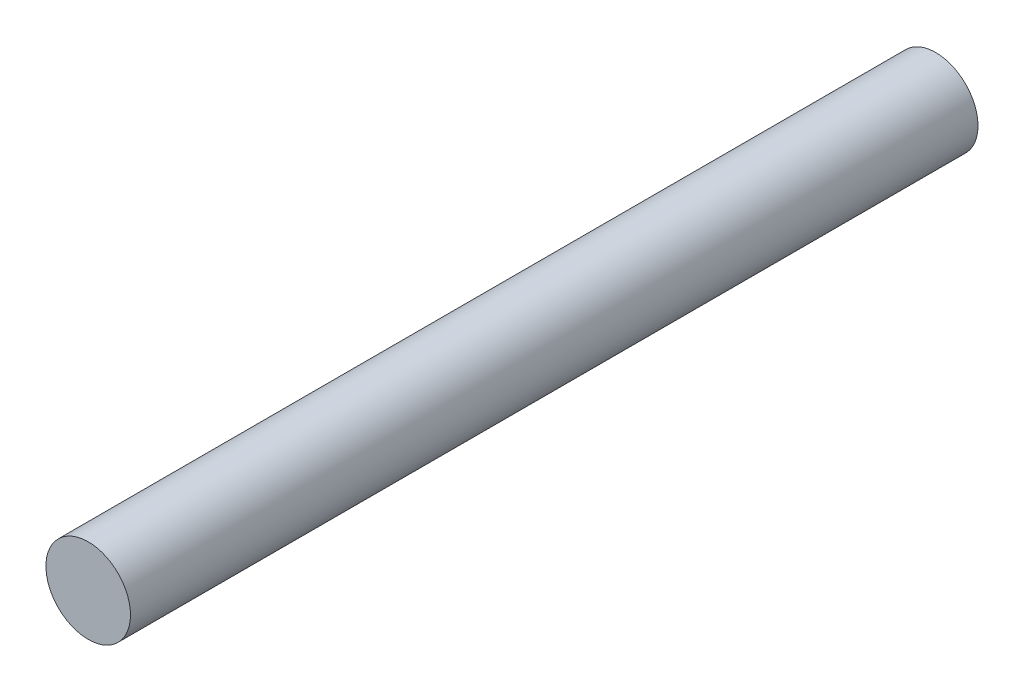
ISO-10303-21;
HEADER;
FILE_DESCRIPTION(('STEP AP214'),'2;1');
FILE_NAME('part.step','',(''),(''),'','','');
FILE_SCHEMA(('AUTOMOTIVE_DESIGN { 1 0 10303 214 1 1 1 1 }'));
ENDSEC;
DATA;
#1=APPLICATION_CONTEXT('core data for automotive mechanical design processes');
#2=APPLICATION_PROTOCOL_DEFINITION('international standard','automotive_design',2000,#1);
#3=PRODUCT_CONTEXT('',#1,'mechanical');
#4=PRODUCT('Part','Part','',(#3));
#5=PRODUCT_RELATED_PRODUCT_CATEGORY('part','',(#4));
#6=PRODUCT_DEFINITION_FORMATION('','',#4);
#7=PRODUCT_DEFINITION_CONTEXT('part definition',#1,'design');
#8=PRODUCT_DEFINITION('design','',#6,#7);
#9=PRODUCT_DEFINITION_SHAPE('','',#8);
#10=(LENGTH_UNIT() NAMED_UNIT(*) SI_UNIT(.MILLI.,.METRE.));
#11=(NAMED_UNIT(*) PLANE_ANGLE_UNIT() SI_UNIT($,.RADIAN.));
#12=(NAMED_UNIT(*) SI_UNIT($,.STERADIAN.) SOLID_ANGLE_UNIT());
#13=UNCERTAINTY_MEASURE_WITH_UNIT(LENGTH_MEASURE(1.E-05),#10,'distance_accuracy_value','');
#14=(GEOMETRIC_REPRESENTATION_CONTEXT(3) GLOBAL_UNCERTAINTY_ASSIGNED_CONTEXT((#13)) GLOBAL_UNIT_ASSIGNED_CONTEXT((#10,
#11,#12)) REPRESENTATION_CONTEXT('',''));
#15=CARTESIAN_POINT('',(0.,0.,0.));
#16=DIRECTION('',(0.,0.,1.));
#17=DIRECTION('',(1.,0.,0.));
#18=AXIS2_PLACEMENT_3D('',#15,#16,#17);
#19=CARTESIAN_POINT('',(0.,0.,40.08));
#20=DIRECTION('',(0.,0.,-1.));
#21=DIRECTION('',(-1.,0.,0.));
#22=AXIS2_PLACEMENT_3D('',#19,#20,#21);
#23=CYLINDRICAL_SURFACE('',#22,2.);
#24=CARTESIAN_POINT('',(0.,0.,40.08));
#25=DIRECTION('',(0.,0.,1.));
#26=DIRECTION('',(1.,0.,0.));
#27=AXIS2_PLACEMENT_3D('',#24,#25,#26);
#28=CIRCLE('',#27,2.);
#29=CARTESIAN_POINT('',(2.,0.,40.08));
#30=VERTEX_POINT('',#29);
#31=EDGE_CURVE('E10',#30,#30,#28,.T.);
#32=ORIENTED_EDGE('',*,*,#31,.F.);
#33=EDGE_LOOP('',(#32));
#34=FACE_BOUND('',#33,.T.);
#35=CARTESIAN_POINT('',(0.,0.,0.));
#36=DIRECTION('',(0.,0.,1.));
#37=DIRECTION('',(1.,0.,0.));
#38=AXIS2_PLACEMENT_3D('',#35,#36,#37);
#39=CIRCLE('',#38,2.);
#40=CARTESIAN_POINT('',(2.,0.,0.));
#41=VERTEX_POINT('',#40);
#42=EDGE_CURVE('E40',#41,#41,#39,.T.);
#43=ORIENTED_EDGE('',*,*,#42,.T.);
#44=EDGE_LOOP('',(#43));
#45=FACE_BOUND('',#44,.T.);
#46=ADVANCED_FACE('F37',(#34,#45),#23,.T.);
#47=CARTESIAN_POINT('',(0.,0.,40.08));
#48=DIRECTION('',(0.,0.,1.));
#49=DIRECTION('',(1.,0.,0.));
#50=AXIS2_PLACEMENT_3D('',#47,#48,#49);
#51=PLANE('',#50);
#52=ORIENTED_EDGE('',*,*,#31,.T.);
#53=EDGE_LOOP('',(#52));
#54=FACE_BOUND('',#53,.T.);
#55=ADVANCED_FACE('F52',(#54),#51,.T.);
#56=CARTESIAN_POINT('',(0.,0.,0.));
#57=DIRECTION('',(0.,0.,1.));
#58=DIRECTION('',(1.,0.,0.));
#59=AXIS2_PLACEMENT_3D('',#56,#57,#58);
#60=PLANE('',#59);
#61=ORIENTED_EDGE('',*,*,#42,.F.);
#62=EDGE_LOOP('',(#61));
#63=FACE_BOUND('',#62,.T.);
#64=ADVANCED_FACE('F50',(#63),#60,.F.);
#65=CLOSED_SHELL('',(#46,#55,#64));
#66=MANIFOLD_SOLID_BREP('B2',#65);
#67=ADVANCED_BREP_SHAPE_REPRESENTATION('',(#18,#66),#14);
#68=SHAPE_DEFINITION_REPRESENTATION(#9,#67);
ENDSEC;
END-ISO-10303-21;
